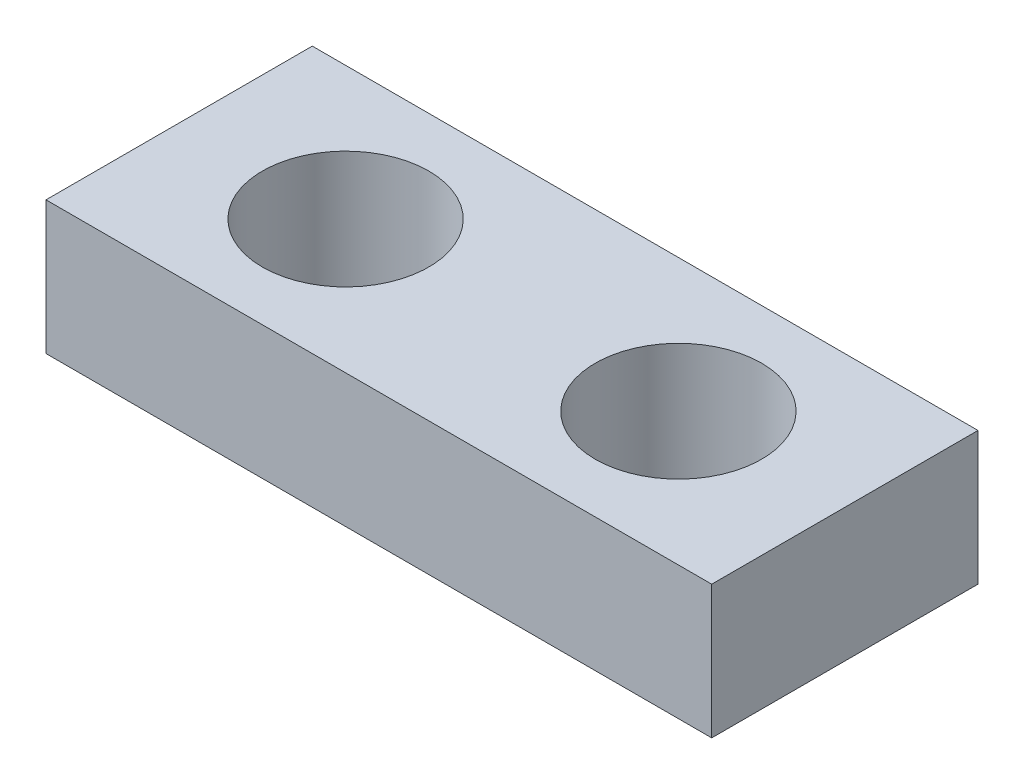
ISO-10303-21;
HEADER;
FILE_DESCRIPTION(('STEP AP214'),'2;1');
FILE_NAME('part.step','',(''),(''),'','','');
FILE_SCHEMA(('AUTOMOTIVE_DESIGN { 1 0 10303 214 1 1 1 1 }'));
ENDSEC;
DATA;
#1=APPLICATION_CONTEXT('core data for automotive mechanical design processes');
#2=APPLICATION_PROTOCOL_DEFINITION('international standard','automotive_design',2000,#1);
#3=PRODUCT_CONTEXT('',#1,'mechanical');
#4=PRODUCT('Part','Part','',(#3));
#5=PRODUCT_RELATED_PRODUCT_CATEGORY('part','',(#4));
#6=PRODUCT_DEFINITION_FORMATION('','',#4);
#7=PRODUCT_DEFINITION_CONTEXT('part definition',#1,'design');
#8=PRODUCT_DEFINITION('design','',#6,#7);
#9=PRODUCT_DEFINITION_SHAPE('','',#8);
#10=(LENGTH_UNIT() NAMED_UNIT(*) SI_UNIT(.MILLI.,.METRE.));
#11=(NAMED_UNIT(*) PLANE_ANGLE_UNIT() SI_UNIT($,.RADIAN.));
#12=(NAMED_UNIT(*) SI_UNIT($,.STERADIAN.) SOLID_ANGLE_UNIT());
#13=UNCERTAINTY_MEASURE_WITH_UNIT(LENGTH_MEASURE(1.E-05),#10,'distance_accuracy_value','');
#14=(GEOMETRIC_REPRESENTATION_CONTEXT(3) GLOBAL_UNCERTAINTY_ASSIGNED_CONTEXT((#13)) GLOBAL_UNIT_ASSIGNED_CONTEXT((#10,
#11,#12)) REPRESENTATION_CONTEXT('',''));
#15=CARTESIAN_POINT('',(0.,0.,0.));
#16=DIRECTION('',(0.,0.,1.));
#17=DIRECTION('',(1.,0.,0.));
#18=AXIS2_PLACEMENT_3D('',#15,#16,#17);
#19=CARTESIAN_POINT('',(0.,25.4,0.));
#20=DIRECTION('',(1.,0.,0.));
#21=DIRECTION('',(0.,0.,-1.));
#22=AXIS2_PLACEMENT_3D('',#19,#20,#21);
#23=PLANE('',#22);
#24=DIRECTION('',(0.,0.,1.));
#25=VECTOR('',#24,1.);
#26=CARTESIAN_POINT('',(0.,0.,0.));
#27=LINE('',#26,#25);
#28=CARTESIAN_POINT('',(0.,0.,-50.8));
#29=VERTEX_POINT('',#28);
#30=CARTESIAN_POINT('',(0.,0.,0.));
#31=VERTEX_POINT('',#30);
#32=EDGE_CURVE('E95',#29,#31,#27,.T.);
#33=ORIENTED_EDGE('',*,*,#32,.T.);
#34=DIRECTION('',(0.,-1.,0.));
#35=VECTOR('',#34,1.);
#36=CARTESIAN_POINT('',(0.,25.4,0.));
#37=LINE('',#36,#35);
#38=CARTESIAN_POINT('',(0.,25.4,0.));
#39=VERTEX_POINT('',#38);
#40=EDGE_CURVE('E11',#39,#31,#37,.T.);
#41=ORIENTED_EDGE('',*,*,#40,.F.);
#42=DIRECTION('',(0.,0.,1.));
#43=VECTOR('',#42,1.);
#44=CARTESIAN_POINT('',(0.,25.4,0.));
#45=LINE('',#44,#43);
#46=CARTESIAN_POINT('',(0.,25.4,-50.8));
#47=VERTEX_POINT('',#46);
#48=EDGE_CURVE('E83',#47,#39,#45,.T.);
#49=ORIENTED_EDGE('',*,*,#48,.F.);
#50=DIRECTION('',(0.,-1.,0.));
#51=VECTOR('',#50,1.);
#52=CARTESIAN_POINT('',(0.,25.4,-50.8));
#53=LINE('',#52,#51);
#54=EDGE_CURVE('E91',#47,#29,#53,.T.);
#55=ORIENTED_EDGE('',*,*,#54,.T.);
#56=EDGE_LOOP('',(#33,#41,#49,#55));
#57=FACE_BOUND('',#56,.T.);
#58=ADVANCED_FACE('F32',(#57),#23,.F.);
#59=CARTESIAN_POINT('',(0.,25.4,0.));
#60=DIRECTION('',(0.,0.,-1.));
#61=DIRECTION('',(-1.,0.,0.));
#62=AXIS2_PLACEMENT_3D('',#59,#60,#61);
#63=PLANE('',#62);
#64=DIRECTION('',(1.,0.,0.));
#65=VECTOR('',#64,1.);
#66=CARTESIAN_POINT('',(0.,0.,0.));
#67=LINE('',#66,#65);
#68=CARTESIAN_POINT('',(127.,0.,0.));
#69=VERTEX_POINT('',#68);
#70=EDGE_CURVE('E87',#31,#69,#67,.T.);
#71=ORIENTED_EDGE('',*,*,#70,.T.);
#72=DIRECTION('',(0.,-1.,0.));
#73=VECTOR('',#72,1.);
#74=CARTESIAN_POINT('',(127.,25.4,0.));
#75=LINE('',#74,#73);
#76=CARTESIAN_POINT('',(127.,25.4,0.));
#77=VERTEX_POINT('',#76);
#78=EDGE_CURVE('E40',#77,#69,#75,.T.);
#79=ORIENTED_EDGE('',*,*,#78,.F.);
#80=DIRECTION('',(1.,0.,0.));
#81=VECTOR('',#80,1.);
#82=CARTESIAN_POINT('',(0.,25.4,0.));
#83=LINE('',#82,#81);
#84=EDGE_CURVE('E78',#39,#77,#83,.T.);
#85=ORIENTED_EDGE('',*,*,#84,.F.);
#86=ORIENTED_EDGE('',*,*,#40,.T.);
#87=EDGE_LOOP('',(#71,#79,#85,#86));
#88=FACE_BOUND('',#87,.T.);
#89=ADVANCED_FACE('F86',(#88),#63,.F.);
#90=CARTESIAN_POINT('',(127.,25.4,0.));
#91=DIRECTION('',(-1.,0.,0.));
#92=DIRECTION('',(0.,0.,1.));
#93=AXIS2_PLACEMENT_3D('',#90,#91,#92);
#94=PLANE('',#93);
#95=DIRECTION('',(0.,0.,-1.));
#96=VECTOR('',#95,1.);
#97=CARTESIAN_POINT('',(127.,0.,0.));
#98=LINE('',#97,#96);
#99=CARTESIAN_POINT('',(127.,0.,-50.8));
#100=VERTEX_POINT('',#99);
#101=EDGE_CURVE('E65',#69,#100,#98,.T.);
#102=ORIENTED_EDGE('',*,*,#101,.T.);
#103=DIRECTION('',(0.,-1.,0.));
#104=VECTOR('',#103,1.);
#105=CARTESIAN_POINT('',(127.,25.4,-50.8));
#106=LINE('',#105,#104);
#107=CARTESIAN_POINT('',(127.,25.4,-50.8));
#108=VERTEX_POINT('',#107);
#109=EDGE_CURVE('E88',#108,#100,#106,.T.);
#110=ORIENTED_EDGE('',*,*,#109,.F.);
#111=DIRECTION('',(0.,0.,-1.));
#112=VECTOR('',#111,1.);
#113=CARTESIAN_POINT('',(127.,25.4,0.));
#114=LINE('',#113,#112);
#115=EDGE_CURVE('E81',#77,#108,#114,.T.);
#116=ORIENTED_EDGE('',*,*,#115,.F.);
#117=ORIENTED_EDGE('',*,*,#78,.T.);
#118=EDGE_LOOP('',(#102,#110,#116,#117));
#119=FACE_BOUND('',#118,.T.);
#120=ADVANCED_FACE('F89',(#119),#94,.F.);
#121=CARTESIAN_POINT('',(0.,25.4,-50.8));
#122=DIRECTION('',(0.,0.,1.));
#123=DIRECTION('',(1.,0.,0.));
#124=AXIS2_PLACEMENT_3D('',#121,#122,#123);
#125=PLANE('',#124);
#126=DIRECTION('',(-1.,0.,0.));
#127=VECTOR('',#126,1.);
#128=CARTESIAN_POINT('',(0.,0.,-50.8));
#129=LINE('',#128,#127);
#130=EDGE_CURVE('E71',#100,#29,#129,.T.);
#131=ORIENTED_EDGE('',*,*,#130,.T.);
#132=ORIENTED_EDGE('',*,*,#54,.F.);
#133=DIRECTION('',(-1.,0.,0.));
#134=VECTOR('',#133,1.);
#135=CARTESIAN_POINT('',(0.,25.4,-50.8));
#136=LINE('',#135,#134);
#137=EDGE_CURVE('E48',#108,#47,#136,.T.);
#138=ORIENTED_EDGE('',*,*,#137,.F.);
#139=ORIENTED_EDGE('',*,*,#109,.T.);
#140=EDGE_LOOP('',(#131,#132,#138,#139));
#141=FACE_BOUND('',#140,.T.);
#142=ADVANCED_FACE('F103',(#141),#125,.F.);
#143=CARTESIAN_POINT('',(0.,25.4,0.));
#144=DIRECTION('',(0.,-1.,0.));
#145=DIRECTION('',(0.,0.,-1.));
#146=AXIS2_PLACEMENT_3D('',#143,#144,#145);
#147=PLANE('',#146);
#148=CARTESIAN_POINT('',(95.25,25.4,-25.4));
#149=DIRECTION('',(0.,1.,0.));
#150=DIRECTION('',(0.,0.,1.));
#151=AXIS2_PLACEMENT_3D('',#148,#149,#150);
#152=CIRCLE('',#151,15.875);
#153=CARTESIAN_POINT('',(95.25,25.4,-9.525));
#154=VERTEX_POINT('',#153);
#155=EDGE_CURVE('E115',#154,#154,#152,.T.);
#156=ORIENTED_EDGE('',*,*,#155,.F.);
#157=EDGE_LOOP('',(#156));
#158=FACE_BOUND('',#157,.T.);
#159=CARTESIAN_POINT('',(31.75,25.4,-25.4));
#160=DIRECTION('',(0.,1.,0.));
#161=DIRECTION('',(0.,0.,1.));
#162=AXIS2_PLACEMENT_3D('',#159,#160,#161);
#163=CIRCLE('',#162,15.875);
#164=CARTESIAN_POINT('',(31.75,25.4,-9.525));
#165=VERTEX_POINT('',#164);
#166=EDGE_CURVE('E109',#165,#165,#163,.T.);
#167=ORIENTED_EDGE('',*,*,#166,.F.);
#168=EDGE_LOOP('',(#167));
#169=FACE_BOUND('',#168,.T.);
#170=ORIENTED_EDGE('',*,*,#48,.T.);
#171=ORIENTED_EDGE('',*,*,#84,.T.);
#172=ORIENTED_EDGE('',*,*,#115,.T.);
#173=ORIENTED_EDGE('',*,*,#137,.T.);
#174=EDGE_LOOP('',(#170,#171,#172,#173));
#175=FACE_BOUND('',#174,.T.);
#176=ADVANCED_FACE('F79',(#158,#169,#175),#147,.F.);
#177=CARTESIAN_POINT('',(0.,0.,0.));
#178=DIRECTION('',(0.,-1.,0.));
#179=DIRECTION('',(0.,0.,-1.));
#180=AXIS2_PLACEMENT_3D('',#177,#178,#179);
#181=PLANE('',#180);
#182=CARTESIAN_POINT('',(95.25,0.,-25.4));
#183=DIRECTION('',(0.,1.,0.));
#184=DIRECTION('',(0.,0.,1.));
#185=AXIS2_PLACEMENT_3D('',#182,#183,#184);
#186=CIRCLE('',#185,15.875);
#187=CARTESIAN_POINT('',(95.25,0.,-9.525));
#188=VERTEX_POINT('',#187);
#189=EDGE_CURVE('E112',#188,#188,#186,.T.);
#190=ORIENTED_EDGE('',*,*,#189,.T.);
#191=EDGE_LOOP('',(#190));
#192=FACE_BOUND('',#191,.T.);
#193=CARTESIAN_POINT('',(31.75,0.,-25.4));
#194=DIRECTION('',(0.,1.,0.));
#195=DIRECTION('',(0.,0.,1.));
#196=AXIS2_PLACEMENT_3D('',#193,#194,#195);
#197=CIRCLE('',#196,15.875);
#198=CARTESIAN_POINT('',(31.75,0.,-9.525));
#199=VERTEX_POINT('',#198);
#200=EDGE_CURVE('E98',#199,#199,#197,.T.);
#201=ORIENTED_EDGE('',*,*,#200,.T.);
#202=EDGE_LOOP('',(#201));
#203=FACE_BOUND('',#202,.T.);
#204=ORIENTED_EDGE('',*,*,#32,.F.);
#205=ORIENTED_EDGE('',*,*,#130,.F.);
#206=ORIENTED_EDGE('',*,*,#101,.F.);
#207=ORIENTED_EDGE('',*,*,#70,.F.);
#208=EDGE_LOOP('',(#204,#205,#206,#207));
#209=FACE_BOUND('',#208,.T.);
#210=ADVANCED_FACE('F106',(#192,#203,#209),#181,.T.);
#211=CARTESIAN_POINT('',(31.75,0.,-25.4));
#212=DIRECTION('',(0.,1.,0.));
#213=DIRECTION('',(0.,0.,1.));
#214=AXIS2_PLACEMENT_3D('',#211,#212,#213);
#215=CYLINDRICAL_SURFACE('',#214,15.875);
#216=CARTESIAN_POINT('',(31.75,0.,-9.525));
#217=CARTESIAN_POINT('',(31.75,0.264583333333333,-9.525));
#218=CARTESIAN_POINT('',(31.75,0.529166666666667,-9.525));
#219=CARTESIAN_POINT('',(31.75,1.05833333333333,-9.525));
#220=CARTESIAN_POINT('',(31.75,1.32291666666667,-9.525));
#221=CARTESIAN_POINT('',(31.75,1.85208333333333,-9.525));
#222=CARTESIAN_POINT('',(31.75,2.11666666666667,-9.525));
#223=CARTESIAN_POINT('',(31.75,2.64583333333333,-9.525));
#224=CARTESIAN_POINT('',(31.75,2.91041666666667,-9.525));
#225=CARTESIAN_POINT('',(31.75,3.43958333333333,-9.525));
#226=CARTESIAN_POINT('',(31.75,3.70416666666667,-9.525));
#227=CARTESIAN_POINT('',(31.75,4.23333333333333,-9.525));
#228=CARTESIAN_POINT('',(31.75,4.49791666666667,-9.525));
#229=CARTESIAN_POINT('',(31.75,5.02708333333333,-9.525));
#230=CARTESIAN_POINT('',(31.75,5.29166666666667,-9.525));
#231=CARTESIAN_POINT('',(31.75,5.82083333333333,-9.525));
#232=CARTESIAN_POINT('',(31.75,6.08541666666667,-9.525));
#233=CARTESIAN_POINT('',(31.75,6.61458333333333,-9.525));
#234=CARTESIAN_POINT('',(31.75,6.87916666666667,-9.525));
#235=CARTESIAN_POINT('',(31.75,7.40833333333333,-9.525));
#236=CARTESIAN_POINT('',(31.75,7.67291666666667,-9.525));
#237=CARTESIAN_POINT('',(31.75,8.20208333333333,-9.525));
#238=CARTESIAN_POINT('',(31.75,8.46666666666667,-9.525));
#239=CARTESIAN_POINT('',(31.75,8.99583333333334,-9.525));
#240=CARTESIAN_POINT('',(31.75,9.26041666666667,-9.525));
#241=CARTESIAN_POINT('',(31.75,9.78958333333333,-9.525));
#242=CARTESIAN_POINT('',(31.75,10.0541666666667,-9.525));
#243=CARTESIAN_POINT('',(31.75,10.5833333333333,-9.525));
#244=CARTESIAN_POINT('',(31.75,10.8479166666667,-9.525));
#245=CARTESIAN_POINT('',(31.75,11.3770833333333,-9.525));
#246=CARTESIAN_POINT('',(31.75,11.6416666666667,-9.525));
#247=CARTESIAN_POINT('',(31.75,12.1708333333333,-9.525));
#248=CARTESIAN_POINT('',(31.75,12.4354166666667,-9.525));
#249=CARTESIAN_POINT('',(31.75,12.9645833333333,-9.525));
#250=CARTESIAN_POINT('',(31.75,13.2291666666667,-9.525));
#251=CARTESIAN_POINT('',(31.75,13.7583333333333,-9.525));
#252=CARTESIAN_POINT('',(31.75,14.0229166666667,-9.525));
#253=CARTESIAN_POINT('',(31.75,14.5520833333333,-9.525));
#254=CARTESIAN_POINT('',(31.75,14.8166666666667,-9.525));
#255=CARTESIAN_POINT('',(31.75,15.3458333333333,-9.525));
#256=CARTESIAN_POINT('',(31.75,15.6104166666667,-9.525));
#257=CARTESIAN_POINT('',(31.75,16.1395833333333,-9.525));
#258=CARTESIAN_POINT('',(31.75,16.4041666666667,-9.525));
#259=CARTESIAN_POINT('',(31.75,16.9333333333333,-9.525));
#260=CARTESIAN_POINT('',(31.75,17.1979166666667,-9.525));
#261=CARTESIAN_POINT('',(31.75,17.7270833333333,-9.525));
#262=CARTESIAN_POINT('',(31.75,17.9916666666667,-9.525));
#263=CARTESIAN_POINT('',(31.75,18.5208333333333,-9.525));
#264=CARTESIAN_POINT('',(31.75,18.7854166666667,-9.525));
#265=CARTESIAN_POINT('',(31.75,19.3145833333333,-9.525));
#266=CARTESIAN_POINT('',(31.75,19.5791666666667,-9.525));
#267=CARTESIAN_POINT('',(31.75,20.1083333333333,-9.525));
#268=CARTESIAN_POINT('',(31.75,20.3729166666667,-9.525));
#269=CARTESIAN_POINT('',(31.75,20.9020833333333,-9.525));
#270=CARTESIAN_POINT('',(31.75,21.1666666666667,-9.525));
#271=CARTESIAN_POINT('',(31.75,21.6958333333333,-9.525));
#272=CARTESIAN_POINT('',(31.75,21.9604166666667,-9.525));
#273=CARTESIAN_POINT('',(31.75,22.4895833333333,-9.525));
#274=CARTESIAN_POINT('',(31.75,22.7541666666667,-9.525));
#275=CARTESIAN_POINT('',(31.75,23.2833333333333,-9.525));
#276=CARTESIAN_POINT('',(31.75,23.5479166666667,-9.525));
#277=CARTESIAN_POINT('',(31.75,24.0770833333333,-9.525));
#278=CARTESIAN_POINT('',(31.75,24.3416666666667,-9.525));
#279=CARTESIAN_POINT('',(31.75,24.8708333333333,-9.525));
#280=CARTESIAN_POINT('',(31.75,25.1354166666667,-9.525));
#281=CARTESIAN_POINT('',(31.75,25.4,-9.525));
#282=B_SPLINE_CURVE_WITH_KNOTS('',3,(#216,#217,#218,#219,#220,#221,#222,#223,#224,#225,#226,
#227,#228,#229,#230,#231,#232,#233,#234,#235,#236,#237,#238,#239,#240,#241,#242,#243,#244,#245,
#246,#247,#248,#249,#250,#251,#252,#253,#254,#255,#256,#257,#258,#259,#260,#261,#262,#263,#264,
#265,#266,#267,#268,#269,#270,#271,#272,#273,#274,#275,#276,#277,#278,#279,#280,#281),
.UNSPECIFIED.,.F.,.F.,(4,2,2,2,2,2,2,2,2,2,2,2,2,2,2,2,2,2,2,2,2,2,2,2,2,2,2,2,2,2,2,2,4),(0.,
0.79375,1.5875,2.38125,3.175,3.96875,4.7625,5.55625,6.35,7.14375,7.9375,8.73125,9.525,10.31875,
11.1125,11.90625,12.7,13.49375,14.2875,15.08125,15.875,16.66875,17.4625,18.25625,19.05,19.84375,
20.6375,21.43125,22.225,23.01875,23.8125,24.60625,25.4),.UNSPECIFIED.);
#283=EDGE_CURVE('BSEAM126',#199,#165,#282,.T.);
#284=ORIENTED_EDGE('',*,*,#200,.F.);
#285=ORIENTED_EDGE('',*,*,#166,.T.);
#286=ORIENTED_EDGE('',*,*,#283,.T.);
#287=ORIENTED_EDGE('',*,*,#283,.F.);
#288=EDGE_LOOP('',(#284,#286,#285,#287));
#289=FACE_BOUND('',#288,.T.);
#290=ADVANCED_FACE('F126',(#289),#215,.F.);
#291=CARTESIAN_POINT('',(95.25,0.,-25.4));
#292=DIRECTION('',(0.,1.,0.));
#293=DIRECTION('',(0.,0.,1.));
#294=AXIS2_PLACEMENT_3D('',#291,#292,#293);
#295=CYLINDRICAL_SURFACE('',#294,15.875);
#296=CARTESIAN_POINT('',(95.25,0.,-9.525));
#297=CARTESIAN_POINT('',(95.25,0.264583333333333,-9.525));
#298=CARTESIAN_POINT('',(95.25,0.529166666666667,-9.525));
#299=CARTESIAN_POINT('',(95.25,1.05833333333333,-9.525));
#300=CARTESIAN_POINT('',(95.25,1.32291666666667,-9.525));
#301=CARTESIAN_POINT('',(95.25,1.85208333333333,-9.525));
#302=CARTESIAN_POINT('',(95.25,2.11666666666667,-9.525));
#303=CARTESIAN_POINT('',(95.25,2.64583333333333,-9.525));
#304=CARTESIAN_POINT('',(95.25,2.91041666666667,-9.525));
#305=CARTESIAN_POINT('',(95.25,3.43958333333333,-9.525));
#306=CARTESIAN_POINT('',(95.25,3.70416666666667,-9.525));
#307=CARTESIAN_POINT('',(95.25,4.23333333333333,-9.525));
#308=CARTESIAN_POINT('',(95.25,4.49791666666667,-9.525));
#309=CARTESIAN_POINT('',(95.25,5.02708333333333,-9.525));
#310=CARTESIAN_POINT('',(95.25,5.29166666666667,-9.525));
#311=CARTESIAN_POINT('',(95.25,5.82083333333333,-9.525));
#312=CARTESIAN_POINT('',(95.25,6.08541666666667,-9.525));
#313=CARTESIAN_POINT('',(95.25,6.61458333333333,-9.525));
#314=CARTESIAN_POINT('',(95.25,6.87916666666667,-9.525));
#315=CARTESIAN_POINT('',(95.25,7.40833333333333,-9.525));
#316=CARTESIAN_POINT('',(95.25,7.67291666666667,-9.525));
#317=CARTESIAN_POINT('',(95.25,8.20208333333333,-9.525));
#318=CARTESIAN_POINT('',(95.25,8.46666666666667,-9.525));
#319=CARTESIAN_POINT('',(95.25,8.99583333333334,-9.525));
#320=CARTESIAN_POINT('',(95.25,9.26041666666667,-9.525));
#321=CARTESIAN_POINT('',(95.25,9.78958333333333,-9.525));
#322=CARTESIAN_POINT('',(95.25,10.0541666666667,-9.525));
#323=CARTESIAN_POINT('',(95.25,10.5833333333333,-9.525));
#324=CARTESIAN_POINT('',(95.25,10.8479166666667,-9.525));
#325=CARTESIAN_POINT('',(95.25,11.3770833333333,-9.525));
#326=CARTESIAN_POINT('',(95.25,11.6416666666667,-9.525));
#327=CARTESIAN_POINT('',(95.25,12.1708333333333,-9.525));
#328=CARTESIAN_POINT('',(95.25,12.4354166666667,-9.525));
#329=CARTESIAN_POINT('',(95.25,12.9645833333333,-9.525));
#330=CARTESIAN_POINT('',(95.25,13.2291666666667,-9.525));
#331=CARTESIAN_POINT('',(95.25,13.7583333333333,-9.525));
#332=CARTESIAN_POINT('',(95.25,14.0229166666667,-9.525));
#333=CARTESIAN_POINT('',(95.25,14.5520833333333,-9.525));
#334=CARTESIAN_POINT('',(95.25,14.8166666666667,-9.525));
#335=CARTESIAN_POINT('',(95.25,15.3458333333333,-9.525));
#336=CARTESIAN_POINT('',(95.25,15.6104166666667,-9.525));
#337=CARTESIAN_POINT('',(95.25,16.1395833333333,-9.525));
#338=CARTESIAN_POINT('',(95.25,16.4041666666667,-9.525));
#339=CARTESIAN_POINT('',(95.25,16.9333333333333,-9.525));
#340=CARTESIAN_POINT('',(95.25,17.1979166666667,-9.525));
#341=CARTESIAN_POINT('',(95.25,17.7270833333333,-9.525));
#342=CARTESIAN_POINT('',(95.25,17.9916666666667,-9.525));
#343=CARTESIAN_POINT('',(95.25,18.5208333333333,-9.525));
#344=CARTESIAN_POINT('',(95.25,18.7854166666667,-9.525));
#345=CARTESIAN_POINT('',(95.25,19.3145833333333,-9.525));
#346=CARTESIAN_POINT('',(95.25,19.5791666666667,-9.525));
#347=CARTESIAN_POINT('',(95.25,20.1083333333333,-9.525));
#348=CARTESIAN_POINT('',(95.25,20.3729166666667,-9.525));
#349=CARTESIAN_POINT('',(95.25,20.9020833333333,-9.525));
#350=CARTESIAN_POINT('',(95.25,21.1666666666667,-9.525));
#351=CARTESIAN_POINT('',(95.25,21.6958333333333,-9.525));
#352=CARTESIAN_POINT('',(95.25,21.9604166666667,-9.525));
#353=CARTESIAN_POINT('',(95.25,22.4895833333333,-9.525));
#354=CARTESIAN_POINT('',(95.25,22.7541666666667,-9.525));
#355=CARTESIAN_POINT('',(95.25,23.2833333333333,-9.525));
#356=CARTESIAN_POINT('',(95.25,23.5479166666667,-9.525));
#357=CARTESIAN_POINT('',(95.25,24.0770833333333,-9.525));
#358=CARTESIAN_POINT('',(95.25,24.3416666666667,-9.525));
#359=CARTESIAN_POINT('',(95.25,24.8708333333333,-9.525));
#360=CARTESIAN_POINT('',(95.25,25.1354166666667,-9.525));
#361=CARTESIAN_POINT('',(95.25,25.4,-9.525));
#362=B_SPLINE_CURVE_WITH_KNOTS('',3,(#296,#297,#298,#299,#300,#301,#302,#303,#304,#305,#306,
#307,#308,#309,#310,#311,#312,#313,#314,#315,#316,#317,#318,#319,#320,#321,#322,#323,#324,#325,
#326,#327,#328,#329,#330,#331,#332,#333,#334,#335,#336,#337,#338,#339,#340,#341,#342,#343,#344,
#345,#346,#347,#348,#349,#350,#351,#352,#353,#354,#355,#356,#357,#358,#359,#360,#361),
.UNSPECIFIED.,.F.,.F.,(4,2,2,2,2,2,2,2,2,2,2,2,2,2,2,2,2,2,2,2,2,2,2,2,2,2,2,2,2,2,2,2,4),(0.,
0.79375,1.5875,2.38125,3.175,3.96875,4.7625,5.55625,6.35,7.14375,7.9375,8.73125,9.525,10.31875,
11.1125,11.90625,12.7,13.49375,14.2875,15.08125,15.875,16.66875,17.4625,18.25625,19.05,19.84375,
20.6375,21.43125,22.225,23.01875,23.8125,24.60625,25.4),.UNSPECIFIED.);
#363=EDGE_CURVE('BSEAM123',#188,#154,#362,.T.);
#364=ORIENTED_EDGE('',*,*,#189,.F.);
#365=ORIENTED_EDGE('',*,*,#155,.T.);
#366=ORIENTED_EDGE('',*,*,#363,.T.);
#367=ORIENTED_EDGE('',*,*,#363,.F.);
#368=EDGE_LOOP('',(#364,#366,#365,#367));
#369=FACE_BOUND('',#368,.T.);
#370=ADVANCED_FACE('F123',(#369),#295,.F.);
#371=CLOSED_SHELL('',(#58,#89,#120,#142,#176,#210,#290,#370));
#372=MANIFOLD_SOLID_BREP('B2',#371);
#373=ADVANCED_BREP_SHAPE_REPRESENTATION('',(#18,#372),#14);
#374=SHAPE_DEFINITION_REPRESENTATION(#9,#373);
ENDSEC;
END-ISO-10303-21;
